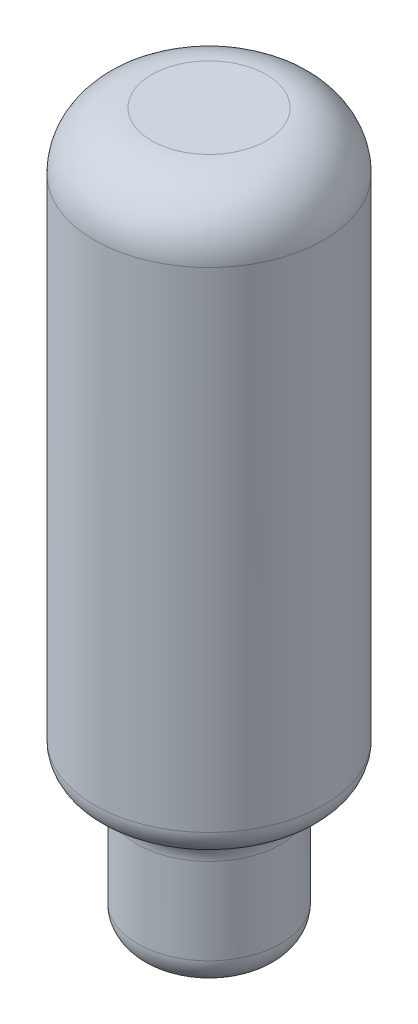
ISO-10303-21;
HEADER;
FILE_DESCRIPTION(('STEP AP214'),'2;1');
FILE_NAME('part.step','',(''),(''),'','','');
FILE_SCHEMA(('AUTOMOTIVE_DESIGN { 1 0 10303 214 1 1 1 1 }'));
ENDSEC;
DATA;
#1=APPLICATION_CONTEXT('core data for automotive mechanical design processes');
#2=APPLICATION_PROTOCOL_DEFINITION('international standard','automotive_design',2000,#1);
#3=PRODUCT_CONTEXT('',#1,'mechanical');
#4=PRODUCT('Part','Part','',(#3));
#5=PRODUCT_RELATED_PRODUCT_CATEGORY('part','',(#4));
#6=PRODUCT_DEFINITION_FORMATION('','',#4);
#7=PRODUCT_DEFINITION_CONTEXT('part definition',#1,'design');
#8=PRODUCT_DEFINITION('design','',#6,#7);
#9=PRODUCT_DEFINITION_SHAPE('','',#8);
#10=(LENGTH_UNIT() NAMED_UNIT(*) SI_UNIT(.MILLI.,.METRE.));
#11=(NAMED_UNIT(*) PLANE_ANGLE_UNIT() SI_UNIT($,.RADIAN.));
#12=(NAMED_UNIT(*) SI_UNIT($,.STERADIAN.) SOLID_ANGLE_UNIT());
#13=UNCERTAINTY_MEASURE_WITH_UNIT(LENGTH_MEASURE(1.E-05),#10,'distance_accuracy_value','');
#14=(GEOMETRIC_REPRESENTATION_CONTEXT(3) GLOBAL_UNCERTAINTY_ASSIGNED_CONTEXT((#13)) GLOBAL_UNIT_ASSIGNED_CONTEXT((#10,
#11,#12)) REPRESENTATION_CONTEXT('',''));
#15=CARTESIAN_POINT('',(0.,0.,0.));
#16=DIRECTION('',(0.,0.,1.));
#17=DIRECTION('',(1.,0.,0.));
#18=AXIS2_PLACEMENT_3D('',#15,#16,#17);
#19=CARTESIAN_POINT('',(0.,20.,0.));
#20=DIRECTION('',(0.,-1.,0.));
#21=DIRECTION('',(0.,0.,-1.));
#22=AXIS2_PLACEMENT_3D('',#19,#20,#21);
#23=CYLINDRICAL_SURFACE('',#22,4.);
#24=CARTESIAN_POINT('',(0.,0.936491673103709,0.));
#25=DIRECTION('',(0.,-1.,0.));
#26=DIRECTION('',(0.,0.,-1.));
#27=AXIS2_PLACEMENT_3D('',#24,#25,#26);
#28=CIRCLE('',#27,4.);
#29=CARTESIAN_POINT('',(0.,0.936491673103709,-4.));
#30=VERTEX_POINT('',#29);
#31=EDGE_CURVE('E60',#30,#30,#28,.F.);
#32=ORIENTED_EDGE('',*,*,#31,.T.);
#33=EDGE_LOOP('',(#32));
#34=FACE_BOUND('',#33,.T.);
#35=CARTESIAN_POINT('',(0.,18.,0.));
#36=DIRECTION('',(0.,1.,0.));
#37=DIRECTION('',(0.,0.,1.));
#38=AXIS2_PLACEMENT_3D('',#35,#36,#37);
#39=CIRCLE('',#38,4.);
#40=CARTESIAN_POINT('',(0.,18.,4.));
#41=VERTEX_POINT('',#40);
#42=EDGE_CURVE('E66',#41,#41,#39,.F.);
#43=ORIENTED_EDGE('',*,*,#42,.T.);
#44=EDGE_LOOP('',(#43));
#45=FACE_BOUND('',#44,.T.);
#46=ADVANCED_FACE('F42',(#34,#45),#23,.T.);
#47=CARTESIAN_POINT('',(0.,20.,0.));
#48=DIRECTION('',(0.,1.,0.));
#49=DIRECTION('',(0.,0.,1.));
#50=AXIS2_PLACEMENT_3D('',#47,#48,#49);
#51=PLANE('',#50);
#52=CARTESIAN_POINT('',(0.,20.,0.));
#53=DIRECTION('',(0.,1.,0.));
#54=DIRECTION('',(0.,0.,1.));
#55=AXIS2_PLACEMENT_3D('',#52,#53,#54);
#56=CIRCLE('',#55,2.);
#57=CARTESIAN_POINT('',(0.,20.,2.));
#58=VERTEX_POINT('',#57);
#59=EDGE_CURVE('E70',#58,#58,#56,.T.);
#60=ORIENTED_EDGE('',*,*,#59,.T.);
#61=EDGE_LOOP('',(#60));
#62=FACE_BOUND('',#61,.T.);
#63=ADVANCED_FACE('F98',(#62),#51,.T.);
#64=CARTESIAN_POINT('',(0.,-5.,0.));
#65=DIRECTION('',(0.,1.,0.));
#66=DIRECTION('',(0.,0.,1.));
#67=AXIS2_PLACEMENT_3D('',#64,#65,#66);
#68=CYLINDRICAL_SURFACE('',#67,2.5);
#69=CARTESIAN_POINT('',(0.,-4.,0.));
#70=DIRECTION('',(0.,-1.,0.));
#71=DIRECTION('',(0.,0.,-1.));
#72=AXIS2_PLACEMENT_3D('',#69,#70,#71);
#73=CIRCLE('',#72,2.5);
#74=CARTESIAN_POINT('',(0.,-4.,-2.5));
#75=VERTEX_POINT('',#74);
#76=EDGE_CURVE('E10',#75,#75,#73,.F.);
#77=ORIENTED_EDGE('',*,*,#76,.T.);
#78=EDGE_LOOP('',(#77));
#79=FACE_BOUND('',#78,.T.);
#80=CARTESIAN_POINT('',(0.,-1.,0.));
#81=DIRECTION('',(0.,1.,0.));
#82=DIRECTION('',(0.,0.,1.));
#83=AXIS2_PLACEMENT_3D('',#80,#81,#82);
#84=CIRCLE('',#83,2.5);
#85=CARTESIAN_POINT('',(0.,-1.,2.5));
#86=VERTEX_POINT('',#85);
#87=EDGE_CURVE('E74',#86,#86,#84,.F.);
#88=ORIENTED_EDGE('',*,*,#87,.T.);
#89=EDGE_LOOP('',(#88));
#90=FACE_BOUND('',#89,.T.);
#91=ADVANCED_FACE('F79',(#79,#90),#68,.T.);
#92=CARTESIAN_POINT('',(0.,-5.,0.));
#93=DIRECTION('',(0.,-1.,0.));
#94=DIRECTION('',(0.,0.,-1.));
#95=AXIS2_PLACEMENT_3D('',#92,#93,#94);
#96=PLANE('',#95);
#97=CARTESIAN_POINT('',(0.,-5.,0.));
#98=DIRECTION('',(0.,-1.,0.));
#99=DIRECTION('',(0.,0.,-1.));
#100=AXIS2_PLACEMENT_3D('',#97,#98,#99);
#101=CIRCLE('',#100,1.5);
#102=CARTESIAN_POINT('',(0.,-5.,-1.5));
#103=VERTEX_POINT('',#102);
#104=EDGE_CURVE('E50',#103,#103,#101,.T.);
#105=ORIENTED_EDGE('',*,*,#104,.T.);
#106=EDGE_LOOP('',(#105));
#107=FACE_BOUND('',#106,.T.);
#108=ADVANCED_FACE('F84',(#107),#96,.T.);
#109=CARTESIAN_POINT('',(0.,-1.,0.));
#110=DIRECTION('',(0.,1.,0.));
#111=DIRECTION('',(0.,0.,1.));
#112=AXIS2_PLACEMENT_3D('',#109,#110,#111);
#113=TOROIDAL_SURFACE('',#112,3.5,1.);
#114=CARTESIAN_POINT('',(0.,-0.0317541634481222,0.));
#115=DIRECTION('',(0.,-1.,0.));
#116=DIRECTION('',(0.,0.,-1.));
#117=AXIS2_PLACEMENT_3D('',#114,#115,#116);
#118=CIRCLE('',#117,3.24999999999999);
#119=CARTESIAN_POINT('',(0.,-0.0317541634481222,-3.24999999999999));
#120=VERTEX_POINT('',#119);
#121=EDGE_CURVE('E55',#120,#120,#118,.T.);
#122=ORIENTED_EDGE('',*,*,#121,.T.);
#123=EDGE_LOOP('',(#122));
#124=FACE_BOUND('',#123,.T.);
#125=ORIENTED_EDGE('',*,*,#87,.F.);
#126=EDGE_LOOP('',(#125));
#127=FACE_BOUND('',#126,.T.);
#128=ADVANCED_FACE('F81',(#124,#127),#113,.F.);
#129=CARTESIAN_POINT('',(0.,18.,0.));
#130=DIRECTION('',(0.,1.,0.));
#131=DIRECTION('',(0.,0.,1.));
#132=AXIS2_PLACEMENT_3D('',#129,#130,#131);
#133=DEGENERATE_TOROIDAL_SURFACE('',#132,2.,2.,.T.);
#134=ORIENTED_EDGE('',*,*,#42,.F.);
#135=EDGE_LOOP('',(#134));
#136=FACE_BOUND('',#135,.T.);
#137=ORIENTED_EDGE('',*,*,#59,.F.);
#138=EDGE_LOOP('',(#137));
#139=FACE_BOUND('',#138,.T.);
#140=ADVANCED_FACE('F83',(#136,#139),#133,.T.);
#141=CARTESIAN_POINT('',(0.,0.936491673103709,0.));
#142=DIRECTION('',(0.,-1.,0.));
#143=DIRECTION('',(0.,0.,-1.));
#144=AXIS2_PLACEMENT_3D('',#141,#142,#143);
#145=TOROIDAL_SURFACE('',#144,3.,1.);
#146=ORIENTED_EDGE('',*,*,#121,.F.);
#147=EDGE_LOOP('',(#146));
#148=FACE_BOUND('',#147,.T.);
#149=ORIENTED_EDGE('',*,*,#31,.F.);
#150=EDGE_LOOP('',(#149));
#151=FACE_BOUND('',#150,.T.);
#152=ADVANCED_FACE('F92',(#148,#151),#145,.T.);
#153=CARTESIAN_POINT('',(0.,-4.,0.));
#154=DIRECTION('',(0.,-1.,0.));
#155=DIRECTION('',(0.,0.,-1.));
#156=AXIS2_PLACEMENT_3D('',#153,#154,#155);
#157=TOROIDAL_SURFACE('',#156,1.5,1.);
#158=ORIENTED_EDGE('',*,*,#76,.F.);
#159=EDGE_LOOP('',(#158));
#160=FACE_BOUND('',#159,.T.);
#161=ORIENTED_EDGE('',*,*,#104,.F.);
#162=EDGE_LOOP('',(#161));
#163=FACE_BOUND('',#162,.T.);
#164=ADVANCED_FACE('F44',(#160,#163),#157,.T.);
#165=CLOSED_SHELL('',(#46,#63,#91,#108,#128,#140,#152,#164));
#166=MANIFOLD_SOLID_BREP('B2',#165);
#167=ADVANCED_BREP_SHAPE_REPRESENTATION('',(#18,#166),#14);
#168=SHAPE_DEFINITION_REPRESENTATION(#9,#167);
ENDSEC;
END-ISO-10303-21;
